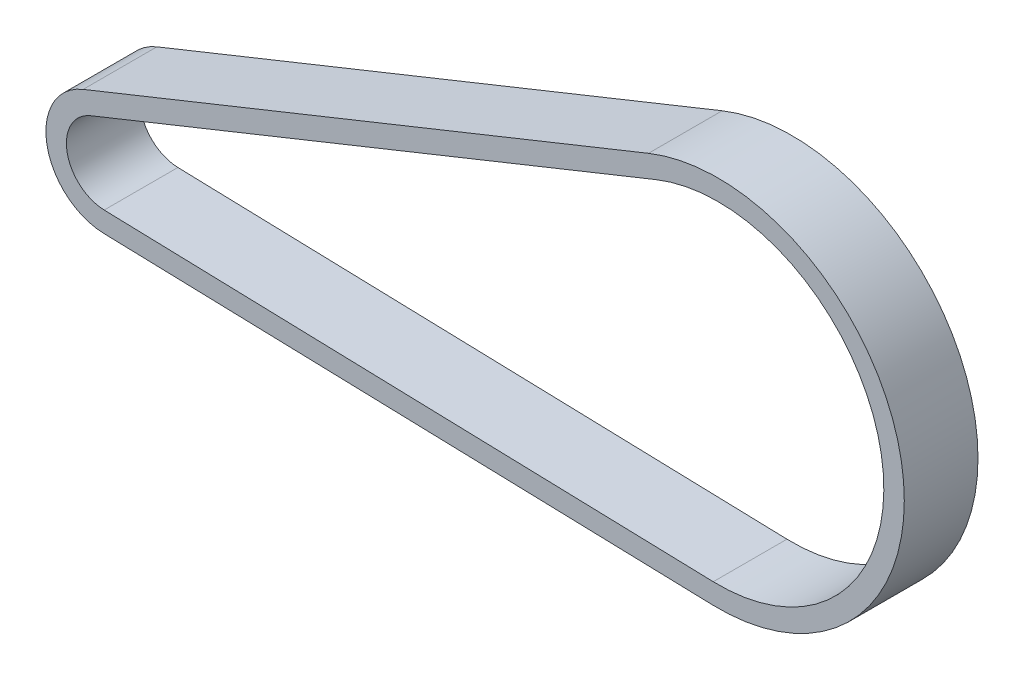
ISO-10303-21;
HEADER;
FILE_DESCRIPTION(('STEP AP214'),'2;1');
FILE_NAME('part.step','',(''),(''),'','','');
FILE_SCHEMA(('AUTOMOTIVE_DESIGN { 1 0 10303 214 1 1 1 1 }'));
ENDSEC;
DATA;
#1=APPLICATION_CONTEXT('core data for automotive mechanical design processes');
#2=APPLICATION_PROTOCOL_DEFINITION('international standard','automotive_design',2000,#1);
#3=PRODUCT_CONTEXT('',#1,'mechanical');
#4=PRODUCT('Part','Part','',(#3));
#5=PRODUCT_RELATED_PRODUCT_CATEGORY('part','',(#4));
#6=PRODUCT_DEFINITION_FORMATION('','',#4);
#7=PRODUCT_DEFINITION_CONTEXT('part definition',#1,'design');
#8=PRODUCT_DEFINITION('design','',#6,#7);
#9=PRODUCT_DEFINITION_SHAPE('','',#8);
#10=(LENGTH_UNIT() NAMED_UNIT(*) SI_UNIT(.MILLI.,.METRE.));
#11=(NAMED_UNIT(*) PLANE_ANGLE_UNIT() SI_UNIT($,.RADIAN.));
#12=(NAMED_UNIT(*) SI_UNIT($,.STERADIAN.) SOLID_ANGLE_UNIT());
#13=UNCERTAINTY_MEASURE_WITH_UNIT(LENGTH_MEASURE(1.E-05),#10,'distance_accuracy_value','');
#14=(GEOMETRIC_REPRESENTATION_CONTEXT(3) GLOBAL_UNCERTAINTY_ASSIGNED_CONTEXT((#13)) GLOBAL_UNIT_ASSIGNED_CONTEXT((#10,
#11,#12)) REPRESENTATION_CONTEXT('',''));
#15=CARTESIAN_POINT('',(0.,0.,0.));
#16=DIRECTION('',(0.,0.,1.));
#17=DIRECTION('',(1.,0.,0.));
#18=AXIS2_PLACEMENT_3D('',#15,#16,#17);
#19=CARTESIAN_POINT('',(-65.5499999999999,44.3800000000003,-8.));
#20=DIRECTION('',(0.,0.,1.));
#21=DIRECTION('',(1.,0.,0.));
#22=AXIS2_PLACEMENT_3D('',#19,#20,#21);
#23=CYLINDRICAL_SURFACE('',#22,29.);
#24=DIRECTION('',(0.,0.,1.));
#25=VECTOR('',#24,1.);
#26=CARTESIAN_POINT('',(-66.376257856973,15.3917731146976,-8.00000000000001));
#27=LINE('',#26,#25);
#28=CARTESIAN_POINT('',(-66.376257856973,15.3917731146976,-8.00000000000001));
#29=VERTEX_POINT('',#28);
#30=CARTESIAN_POINT('',(-66.376257856973,15.3917731146976,28.));
#31=VERTEX_POINT('',#30);
#32=EDGE_CURVE('E88',#29,#31,#27,.T.);
#33=ORIENTED_EDGE('',*,*,#32,.T.);
#34=CARTESIAN_POINT('',(-65.5499999999999,44.3800000000003,28.));
#35=DIRECTION('',(0.,0.,1.));
#36=DIRECTION('',(1.,0.,0.));
#37=AXIS2_PLACEMENT_3D('',#34,#35,#36);
#38=CIRCLE('',#37,29.);
#39=CARTESIAN_POINT('',(-76.3681457792538,71.2866482843707,28.));
#40=VERTEX_POINT('',#39);
#41=EDGE_CURVE('E180',#40,#31,#38,.T.);
#42=ORIENTED_EDGE('',*,*,#41,.F.);
#43=DIRECTION('',(0.,0.,1.));
#44=VECTOR('',#43,1.);
#45=CARTESIAN_POINT('',(-76.3681457792538,71.2866482843707,-8.));
#46=LINE('',#45,#44);
#47=CARTESIAN_POINT('',(-76.3681457792538,71.2866482843707,-8.));
#48=VERTEX_POINT('',#47);
#49=EDGE_CURVE('E12',#48,#40,#46,.T.);
#50=ORIENTED_EDGE('',*,*,#49,.F.);
#51=CARTESIAN_POINT('',(-65.5499999999999,44.3800000000003,-8.));
#52=DIRECTION('',(0.,0.,1.));
#53=DIRECTION('',(1.,0.,0.));
#54=AXIS2_PLACEMENT_3D('',#51,#52,#53);
#55=CIRCLE('',#54,29.);
#56=EDGE_CURVE('E199',#48,#29,#55,.T.);
#57=ORIENTED_EDGE('',*,*,#56,.T.);
#58=EDGE_LOOP('',(#33,#42,#50,#57));
#59=FACE_BOUND('',#58,.T.);
#60=ADVANCED_FACE('F85',(#59),#23,.T.);
#61=CARTESIAN_POINT('',(-76.3681457792538,71.2866482843707,-8.));
#62=DIRECTION('',(-0.373039509629443,0.927815458081738,0.));
#63=DIRECTION('',(-0.927815458081738,-0.373039509629443,0.));
#64=AXIS2_PLACEMENT_3D('',#61,#62,#63);
#65=PLANE('',#64);
#66=ORIENTED_EDGE('',*,*,#49,.T.);
#67=DIRECTION('',(-0.927815458081738,-0.373039509629443,0.));
#68=VECTOR('',#67,1.);
#69=CARTESIAN_POINT('',(-76.3681457792538,71.2866482843707,28.));
#70=LINE('',#69,#68);
#71=CARTESIAN_POINT('',(199.758319041585,182.30665785119,28.));
#72=VERTEX_POINT('',#71);
#73=EDGE_CURVE('E189',#72,#40,#70,.T.);
#74=ORIENTED_EDGE('',*,*,#73,.F.);
#75=DIRECTION('',(0.,0.,1.));
#76=VECTOR('',#75,1.);
#77=CARTESIAN_POINT('',(199.758319041585,182.30665785119,-8.));
#78=LINE('',#77,#76);
#79=CARTESIAN_POINT('',(199.758319041585,182.30665785119,-8.));
#80=VERTEX_POINT('',#79);
#81=EDGE_CURVE('E93',#80,#72,#78,.T.);
#82=ORIENTED_EDGE('',*,*,#81,.F.);
#83=DIRECTION('',(-0.927815458081738,-0.373039509629443,0.));
#84=VECTOR('',#83,1.);
#85=CARTESIAN_POINT('',(-76.3681457792538,71.2866482843707,-8.));
#86=LINE('',#85,#84);
#87=EDGE_CURVE('E210',#80,#48,#86,.T.);
#88=ORIENTED_EDGE('',*,*,#87,.T.);
#89=EDGE_LOOP('',(#66,#74,#82,#88));
#90=FACE_BOUND('',#89,.T.);
#91=ADVANCED_FACE('F222',(#90),#65,.T.);
#92=CARTESIAN_POINT('',(233.704914417865,97.8754511657519,-8.));
#93=DIRECTION('',(0.,0.,1.));
#94=DIRECTION('',(1.,0.,0.));
#95=AXIS2_PLACEMENT_3D('',#92,#93,#94);
#96=CYLINDRICAL_SURFACE('',#95,91.);
#97=ORIENTED_EDGE('',*,*,#81,.T.);
#98=CARTESIAN_POINT('',(233.704914417865,97.8754511657519,28.));
#99=DIRECTION('',(0.,0.,1.));
#100=DIRECTION('',(1.,0.,0.));
#101=AXIS2_PLACEMENT_3D('',#98,#99,#100);
#102=CIRCLE('',#101,91.);
#103=CARTESIAN_POINT('',(231.112174245984,6.9123943877329,28.));
#104=VERTEX_POINT('',#103);
#105=EDGE_CURVE('E186',#104,#72,#102,.T.);
#106=ORIENTED_EDGE('',*,*,#105,.F.);
#107=DIRECTION('',(0.,0.,1.));
#108=VECTOR('',#107,1.);
#109=CARTESIAN_POINT('',(231.112174245984,6.9123943877329,-8.00000000000001));
#110=LINE('',#109,#108);
#111=CARTESIAN_POINT('',(231.112174245984,6.9123943877329,-8.00000000000001));
#112=VERTEX_POINT('',#111);
#113=EDGE_CURVE('E213',#112,#104,#110,.T.);
#114=ORIENTED_EDGE('',*,*,#113,.F.);
#115=CARTESIAN_POINT('',(233.704914417865,97.8754511657519,-8.));
#116=DIRECTION('',(0.,0.,1.));
#117=DIRECTION('',(1.,0.,0.));
#118=AXIS2_PLACEMENT_3D('',#115,#116,#117);
#119=CIRCLE('',#118,91.);
#120=EDGE_CURVE('E207',#112,#80,#119,.T.);
#121=ORIENTED_EDGE('',*,*,#120,.T.);
#122=EDGE_LOOP('',(#97,#106,#114,#121));
#123=FACE_BOUND('',#122,.T.);
#124=ADVANCED_FACE('F228',(#123),#96,.T.);
#125=CARTESIAN_POINT('',(-66.376257856973,15.3917731146976,-8.));
#126=DIRECTION('',(-0.02849165024045,-0.999594030527682,0.));
#127=DIRECTION('',(0.999594030527682,-0.02849165024045,0.));
#128=AXIS2_PLACEMENT_3D('',#125,#126,#127);
#129=PLANE('',#128);
#130=ORIENTED_EDGE('',*,*,#113,.T.);
#131=DIRECTION('',(0.999594030527682,-0.02849165024045,0.));
#132=VECTOR('',#131,1.);
#133=CARTESIAN_POINT('',(-66.376257856973,15.3917731146976,28.));
#134=LINE('',#133,#132);
#135=EDGE_CURVE('E183',#31,#104,#134,.T.);
#136=ORIENTED_EDGE('',*,*,#135,.F.);
#137=ORIENTED_EDGE('',*,*,#32,.F.);
#138=DIRECTION('',(0.999594030527682,-0.02849165024045,0.));
#139=VECTOR('',#138,1.);
#140=CARTESIAN_POINT('',(-66.376257856973,15.3917731146976,-8.));
#141=LINE('',#140,#139);
#142=EDGE_CURVE('E204',#29,#112,#141,.T.);
#143=ORIENTED_EDGE('',*,*,#142,.T.);
#144=EDGE_LOOP('',(#130,#136,#137,#143));
#145=FACE_BOUND('',#144,.T.);
#146=ADVANCED_FACE('F217',(#145),#129,.T.);
#147=CARTESIAN_POINT('',(-65.5499999999999,44.3800000000003,-8.));
#148=DIRECTION('',(0.,0.,1.));
#149=DIRECTION('',(1.,0.,0.));
#150=AXIS2_PLACEMENT_3D('',#147,#148,#149);
#151=PLANE('',#150);
#152=DIRECTION('',(-0.927815458081738,-0.373039509629443,0.));
#153=VECTOR('',#152,1.);
#154=CARTESIAN_POINT('',(-72.6377506829594,62.0084937035534,-8.));
#155=LINE('',#154,#153);
#156=CARTESIAN_POINT('',(203.48871413788,173.028503270373,-8.));
#157=VERTEX_POINT('',#156);
#158=CARTESIAN_POINT('',(-72.6377506829594,62.0084937035534,-8.));
#159=VERTEX_POINT('',#158);
#160=EDGE_CURVE('E162',#157,#159,#155,.T.);
#161=ORIENTED_EDGE('',*,*,#160,.T.);
#162=CARTESIAN_POINT('',(-65.5499999999999,44.3800000000003,-8.));
#163=DIRECTION('',(0.,0.,1.));
#164=DIRECTION('',(1.,0.,0.));
#165=AXIS2_PLACEMENT_3D('',#162,#163,#164);
#166=CIRCLE('',#165,19.);
#167=CARTESIAN_POINT('',(-66.0913413545685,25.3877134199744,-8.00000000000001));
#168=VERTEX_POINT('',#167);
#169=EDGE_CURVE('E192',#159,#168,#166,.T.);
#170=ORIENTED_EDGE('',*,*,#169,.T.);
#171=DIRECTION('',(0.999594030527682,-0.02849165024045,0.));
#172=VECTOR('',#171,1.);
#173=CARTESIAN_POINT('',(-66.0913413545685,25.3877134199744,-8.));
#174=LINE('',#173,#172);
#175=CARTESIAN_POINT('',(231.397090748388,16.9083346930097,-8.));
#176=VERTEX_POINT('',#175);
#177=EDGE_CURVE('E157',#168,#176,#174,.T.);
#178=ORIENTED_EDGE('',*,*,#177,.T.);
#179=CARTESIAN_POINT('',(233.704914417865,97.8754511657519,-8.));
#180=DIRECTION('',(0.,0.,1.));
#181=DIRECTION('',(1.,0.,0.));
#182=AXIS2_PLACEMENT_3D('',#179,#180,#181);
#183=CIRCLE('',#182,81.);
#184=EDGE_CURVE('E101',#176,#157,#183,.T.);
#185=ORIENTED_EDGE('',*,*,#184,.T.);
#186=EDGE_LOOP('',(#161,#170,#178,#185));
#187=FACE_BOUND('',#186,.T.);
#188=ORIENTED_EDGE('',*,*,#56,.F.);
#189=ORIENTED_EDGE('',*,*,#87,.F.);
#190=ORIENTED_EDGE('',*,*,#120,.F.);
#191=ORIENTED_EDGE('',*,*,#142,.F.);
#192=EDGE_LOOP('',(#188,#189,#190,#191));
#193=FACE_BOUND('',#192,.T.);
#194=ADVANCED_FACE('F226',(#187,#193),#151,.F.);
#195=CARTESIAN_POINT('',(-65.5499999999999,44.3800000000003,-8.));
#196=DIRECTION('',(0.,0.,1.));
#197=DIRECTION('',(1.,0.,0.));
#198=AXIS2_PLACEMENT_3D('',#195,#196,#197);
#199=CYLINDRICAL_SURFACE('',#198,19.);
#200=DIRECTION('',(0.,0.,1.));
#201=VECTOR('',#200,1.);
#202=CARTESIAN_POINT('',(-72.6377506829594,62.0084937035534,-8.));
#203=LINE('',#202,#201);
#204=CARTESIAN_POINT('',(-72.6377506829594,62.0084937035534,28.));
#205=VERTEX_POINT('',#204);
#206=EDGE_CURVE('E167',#159,#205,#203,.T.);
#207=ORIENTED_EDGE('',*,*,#206,.T.);
#208=CARTESIAN_POINT('',(-65.5499999999999,44.3800000000003,28.));
#209=DIRECTION('',(0.,0.,1.));
#210=DIRECTION('',(1.,0.,0.));
#211=AXIS2_PLACEMENT_3D('',#208,#209,#210);
#212=CIRCLE('',#211,19.);
#213=CARTESIAN_POINT('',(-66.0913413545685,25.3877134199744,28.));
#214=VERTEX_POINT('',#213);
#215=EDGE_CURVE('E165',#205,#214,#212,.T.);
#216=ORIENTED_EDGE('',*,*,#215,.T.);
#217=DIRECTION('',(0.,0.,1.));
#218=VECTOR('',#217,1.);
#219=CARTESIAN_POINT('',(-66.0913413545685,25.3877134199744,-8.00000000000001));
#220=LINE('',#219,#218);
#221=EDGE_CURVE('E150',#168,#214,#220,.T.);
#222=ORIENTED_EDGE('',*,*,#221,.F.);
#223=ORIENTED_EDGE('',*,*,#169,.F.);
#224=EDGE_LOOP('',(#207,#216,#222,#223));
#225=FACE_BOUND('',#224,.T.);
#226=ADVANCED_FACE('F166',(#225),#199,.F.);
#227=CARTESIAN_POINT('',(-72.6377506829594,62.0084937035534,-8.));
#228=DIRECTION('',(-0.373039509629443,0.927815458081738,0.));
#229=DIRECTION('',(-0.927815458081738,-0.373039509629443,0.));
#230=AXIS2_PLACEMENT_3D('',#227,#228,#229);
#231=PLANE('',#230);
#232=DIRECTION('',(0.,0.,1.));
#233=VECTOR('',#232,1.);
#234=CARTESIAN_POINT('',(203.48871413788,173.028503270373,-8.));
#235=LINE('',#234,#233);
#236=CARTESIAN_POINT('',(203.48871413788,173.028503270373,28.));
#237=VERTEX_POINT('',#236);
#238=EDGE_CURVE('E200',#157,#237,#235,.T.);
#239=ORIENTED_EDGE('',*,*,#238,.T.);
#240=DIRECTION('',(-0.927815458081738,-0.373039509629443,0.));
#241=VECTOR('',#240,1.);
#242=CARTESIAN_POINT('',(-72.6377506829594,62.0084937035534,28.));
#243=LINE('',#242,#241);
#244=EDGE_CURVE('E176',#237,#205,#243,.T.);
#245=ORIENTED_EDGE('',*,*,#244,.T.);
#246=ORIENTED_EDGE('',*,*,#206,.F.);
#247=ORIENTED_EDGE('',*,*,#160,.F.);
#248=EDGE_LOOP('',(#239,#245,#246,#247));
#249=FACE_BOUND('',#248,.T.);
#250=ADVANCED_FACE('F271',(#249),#231,.F.);
#251=CARTESIAN_POINT('',(233.704914417865,97.8754511657519,-8.));
#252=DIRECTION('',(0.,0.,1.));
#253=DIRECTION('',(1.,0.,0.));
#254=AXIS2_PLACEMENT_3D('',#251,#252,#253);
#255=CYLINDRICAL_SURFACE('',#254,81.);
#256=DIRECTION('',(0.,0.,1.));
#257=VECTOR('',#256,1.);
#258=CARTESIAN_POINT('',(231.397090748388,16.9083346930097,-8.00000000000001));
#259=LINE('',#258,#257);
#260=CARTESIAN_POINT('',(231.397090748388,16.9083346930097,28.));
#261=VERTEX_POINT('',#260);
#262=EDGE_CURVE('E161',#176,#261,#259,.T.);
#263=ORIENTED_EDGE('',*,*,#262,.T.);
#264=CARTESIAN_POINT('',(233.704914417865,97.8754511657519,28.));
#265=DIRECTION('',(0.,0.,1.));
#266=DIRECTION('',(1.,0.,0.));
#267=AXIS2_PLACEMENT_3D('',#264,#265,#266);
#268=CIRCLE('',#267,81.);
#269=EDGE_CURVE('E174',#261,#237,#268,.T.);
#270=ORIENTED_EDGE('',*,*,#269,.T.);
#271=ORIENTED_EDGE('',*,*,#238,.F.);
#272=ORIENTED_EDGE('',*,*,#184,.F.);
#273=EDGE_LOOP('',(#263,#270,#271,#272));
#274=FACE_BOUND('',#273,.T.);
#275=ADVANCED_FACE('F280',(#274),#255,.F.);
#276=CARTESIAN_POINT('',(-66.0913413545685,25.3877134199744,-8.));
#277=DIRECTION('',(-0.02849165024045,-0.999594030527682,0.));
#278=DIRECTION('',(0.999594030527682,-0.02849165024045,0.));
#279=AXIS2_PLACEMENT_3D('',#276,#277,#278);
#280=PLANE('',#279);
#281=ORIENTED_EDGE('',*,*,#221,.T.);
#282=DIRECTION('',(0.999594030527682,-0.02849165024045,0.));
#283=VECTOR('',#282,1.);
#284=CARTESIAN_POINT('',(-66.0913413545685,25.3877134199744,28.));
#285=LINE('',#284,#283);
#286=EDGE_CURVE('E154',#214,#261,#285,.T.);
#287=ORIENTED_EDGE('',*,*,#286,.T.);
#288=ORIENTED_EDGE('',*,*,#262,.F.);
#289=ORIENTED_EDGE('',*,*,#177,.F.);
#290=EDGE_LOOP('',(#281,#287,#288,#289));
#291=FACE_BOUND('',#290,.T.);
#292=ADVANCED_FACE('F152',(#291),#280,.F.);
#293=CARTESIAN_POINT('',(-65.5499999999999,44.3800000000003,28.));
#294=DIRECTION('',(0.,0.,1.));
#295=DIRECTION('',(1.,0.,0.));
#296=AXIS2_PLACEMENT_3D('',#293,#294,#295);
#297=PLANE('',#296);
#298=ORIENTED_EDGE('',*,*,#41,.T.);
#299=ORIENTED_EDGE('',*,*,#135,.T.);
#300=ORIENTED_EDGE('',*,*,#105,.T.);
#301=ORIENTED_EDGE('',*,*,#73,.T.);
#302=EDGE_LOOP('',(#298,#299,#300,#301));
#303=FACE_BOUND('',#302,.T.);
#304=ORIENTED_EDGE('',*,*,#286,.F.);
#305=ORIENTED_EDGE('',*,*,#215,.F.);
#306=ORIENTED_EDGE('',*,*,#244,.F.);
#307=ORIENTED_EDGE('',*,*,#269,.F.);
#308=EDGE_LOOP('',(#304,#305,#306,#307));
#309=FACE_BOUND('',#308,.T.);
#310=ADVANCED_FACE('F172',(#303,#309),#297,.T.);
#311=CLOSED_SHELL('',(#60,#91,#124,#146,#194,#226,#250,#275,#292,#310));
#312=MANIFOLD_SOLID_BREP('B2',#311);
#313=ADVANCED_BREP_SHAPE_REPRESENTATION('',(#18,#312),#14);
#314=SHAPE_DEFINITION_REPRESENTATION(#9,#313);
ENDSEC;
END-ISO-10303-21;
